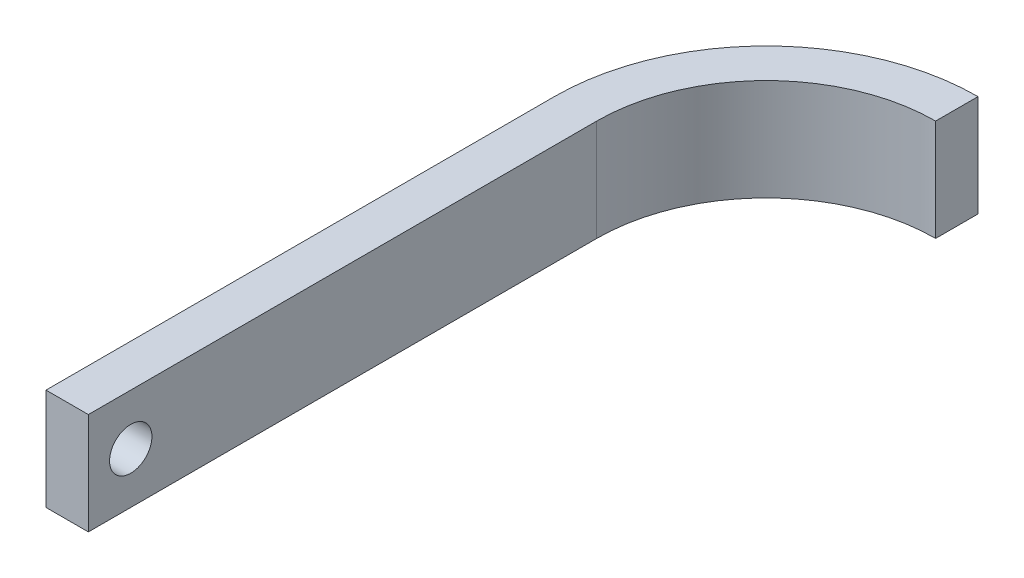
ISO-10303-21;
HEADER;
FILE_DESCRIPTION(('STEP AP214'),'2;1');
FILE_NAME('part.step','',(''),(''),'','','');
FILE_SCHEMA(('AUTOMOTIVE_DESIGN { 1 0 10303 214 1 1 1 1 }'));
ENDSEC;
DATA;
#1=APPLICATION_CONTEXT('core data for automotive mechanical design processes');
#2=APPLICATION_PROTOCOL_DEFINITION('international standard','automotive_design',2000,#1);
#3=PRODUCT_CONTEXT('',#1,'mechanical');
#4=PRODUCT('Part','Part','',(#3));
#5=PRODUCT_RELATED_PRODUCT_CATEGORY('part','',(#4));
#6=PRODUCT_DEFINITION_FORMATION('','',#4);
#7=PRODUCT_DEFINITION_CONTEXT('part definition',#1,'design');
#8=PRODUCT_DEFINITION('design','',#6,#7);
#9=PRODUCT_DEFINITION_SHAPE('','',#8);
#10=(LENGTH_UNIT() NAMED_UNIT(*) SI_UNIT(.MILLI.,.METRE.));
#11=(NAMED_UNIT(*) PLANE_ANGLE_UNIT() SI_UNIT($,.RADIAN.));
#12=(NAMED_UNIT(*) SI_UNIT($,.STERADIAN.) SOLID_ANGLE_UNIT());
#13=UNCERTAINTY_MEASURE_WITH_UNIT(LENGTH_MEASURE(1.E-05),#10,'distance_accuracy_value','');
#14=(GEOMETRIC_REPRESENTATION_CONTEXT(3) GLOBAL_UNCERTAINTY_ASSIGNED_CONTEXT((#13)) GLOBAL_UNIT_ASSIGNED_CONTEXT((#10,
#11,#12)) REPRESENTATION_CONTEXT('',''));
#15=CARTESIAN_POINT('',(0.,0.,0.));
#16=DIRECTION('',(0.,0.,1.));
#17=DIRECTION('',(1.,0.,0.));
#18=AXIS2_PLACEMENT_3D('',#15,#16,#17);
#19=CARTESIAN_POINT('',(0.,15.24,0.));
#20=DIRECTION('',(1.,0.,0.));
#21=DIRECTION('',(0.,0.,-1.));
#22=AXIS2_PLACEMENT_3D('',#19,#20,#21);
#23=PLANE('',#22);
#24=CARTESIAN_POINT('',(0.,7.62,-6.35));
#25=DIRECTION('',(1.,0.,0.));
#26=DIRECTION('',(0.,0.,-1.));
#27=AXIS2_PLACEMENT_3D('',#24,#25,#26);
#28=CIRCLE('',#27,3.175);
#29=CARTESIAN_POINT('',(0.,7.62,-9.525));
#30=VERTEX_POINT('',#29);
#31=EDGE_CURVE('E129',#30,#30,#28,.T.);
#32=ORIENTED_EDGE('',*,*,#31,.T.);
#33=EDGE_LOOP('',(#32));
#34=FACE_BOUND('',#33,.T.);
#35=DIRECTION('',(0.,0.,1.));
#36=VECTOR('',#35,1.);
#37=CARTESIAN_POINT('',(0.,0.,0.));
#38=LINE('',#37,#36);
#39=CARTESIAN_POINT('',(0.,0.,-76.2));
#40=VERTEX_POINT('',#39);
#41=CARTESIAN_POINT('',(0.,0.,0.));
#42=VERTEX_POINT('',#41);
#43=EDGE_CURVE('E125',#40,#42,#38,.T.);
#44=ORIENTED_EDGE('',*,*,#43,.T.);
#45=DIRECTION('',(0.,-1.,0.));
#46=VECTOR('',#45,1.);
#47=CARTESIAN_POINT('',(0.,15.24,0.));
#48=LINE('',#47,#46);
#49=CARTESIAN_POINT('',(0.,15.24,0.));
#50=VERTEX_POINT('',#49);
#51=EDGE_CURVE('E11',#50,#42,#48,.T.);
#52=ORIENTED_EDGE('',*,*,#51,.F.);
#53=DIRECTION('',(0.,0.,1.));
#54=VECTOR('',#53,1.);
#55=CARTESIAN_POINT('',(0.,15.24,0.));
#56=LINE('',#55,#54);
#57=CARTESIAN_POINT('',(0.,15.24,-76.2));
#58=VERTEX_POINT('',#57);
#59=EDGE_CURVE('E136',#58,#50,#56,.T.);
#60=ORIENTED_EDGE('',*,*,#59,.F.);
#61=DIRECTION('',(0.,-1.,0.));
#62=VECTOR('',#61,1.);
#63=CARTESIAN_POINT('',(0.,15.24,-76.2));
#64=LINE('',#63,#62);
#65=EDGE_CURVE('E121',#58,#40,#64,.T.);
#66=ORIENTED_EDGE('',*,*,#65,.T.);
#67=EDGE_LOOP('',(#44,#52,#60,#66));
#68=FACE_BOUND('',#67,.T.);
#69=ADVANCED_FACE('F41',(#34,#68),#23,.F.);
#70=CARTESIAN_POINT('',(0.,15.24,0.));
#71=DIRECTION('',(0.,0.,-1.));
#72=DIRECTION('',(-1.,0.,0.));
#73=AXIS2_PLACEMENT_3D('',#70,#71,#72);
#74=PLANE('',#73);
#75=DIRECTION('',(1.,0.,0.));
#76=VECTOR('',#75,1.);
#77=CARTESIAN_POINT('',(0.,0.,0.));
#78=LINE('',#77,#76);
#79=CARTESIAN_POINT('',(6.35,0.,0.));
#80=VERTEX_POINT('',#79);
#81=EDGE_CURVE('E128',#42,#80,#78,.T.);
#82=ORIENTED_EDGE('',*,*,#81,.T.);
#83=DIRECTION('',(0.,-1.,0.));
#84=VECTOR('',#83,1.);
#85=CARTESIAN_POINT('',(6.35,15.24,0.));
#86=LINE('',#85,#84);
#87=CARTESIAN_POINT('',(6.35,15.24,0.));
#88=VERTEX_POINT('',#87);
#89=EDGE_CURVE('E49',#88,#80,#86,.T.);
#90=ORIENTED_EDGE('',*,*,#89,.F.);
#91=DIRECTION('',(1.,0.,0.));
#92=VECTOR('',#91,1.);
#93=CARTESIAN_POINT('',(0.,15.24,0.));
#94=LINE('',#93,#92);
#95=EDGE_CURVE('E94',#50,#88,#94,.T.);
#96=ORIENTED_EDGE('',*,*,#95,.F.);
#97=ORIENTED_EDGE('',*,*,#51,.T.);
#98=EDGE_LOOP('',(#82,#90,#96,#97));
#99=FACE_BOUND('',#98,.T.);
#100=ADVANCED_FACE('F160',(#99),#74,.F.);
#101=CARTESIAN_POINT('',(6.35,15.24,0.));
#102=DIRECTION('',(-1.,0.,0.));
#103=DIRECTION('',(0.,0.,1.));
#104=AXIS2_PLACEMENT_3D('',#101,#102,#103);
#105=PLANE('',#104);
#106=CARTESIAN_POINT('',(6.35,7.62,-6.35));
#107=DIRECTION('',(1.,0.,0.));
#108=DIRECTION('',(0.,0.,-1.));
#109=AXIS2_PLACEMENT_3D('',#106,#107,#108);
#110=CIRCLE('',#109,3.175);
#111=CARTESIAN_POINT('',(6.35,7.62,-9.525));
#112=VERTEX_POINT('',#111);
#113=EDGE_CURVE('E170',#112,#112,#110,.T.);
#114=ORIENTED_EDGE('',*,*,#113,.F.);
#115=EDGE_LOOP('',(#114));
#116=FACE_BOUND('',#115,.T.);
#117=DIRECTION('',(0.,0.,-1.));
#118=VECTOR('',#117,1.);
#119=CARTESIAN_POINT('',(6.35,0.,0.));
#120=LINE('',#119,#118);
#121=CARTESIAN_POINT('',(6.35,0.,-76.2));
#122=VERTEX_POINT('',#121);
#123=EDGE_CURVE('E131',#80,#122,#120,.T.);
#124=ORIENTED_EDGE('',*,*,#123,.T.);
#125=DIRECTION('',(0.,-1.,0.));
#126=VECTOR('',#125,1.);
#127=CARTESIAN_POINT('',(6.35,15.24,-76.2));
#128=LINE('',#127,#126);
#129=CARTESIAN_POINT('',(6.35,15.24,-76.2));
#130=VERTEX_POINT('',#129);
#131=EDGE_CURVE('E116',#130,#122,#128,.T.);
#132=ORIENTED_EDGE('',*,*,#131,.F.);
#133=DIRECTION('',(0.,0.,-1.));
#134=VECTOR('',#133,1.);
#135=CARTESIAN_POINT('',(6.35,15.24,0.));
#136=LINE('',#135,#134);
#137=EDGE_CURVE('E107',#88,#130,#136,.T.);
#138=ORIENTED_EDGE('',*,*,#137,.F.);
#139=ORIENTED_EDGE('',*,*,#89,.T.);
#140=EDGE_LOOP('',(#124,#132,#138,#139));
#141=FACE_BOUND('',#140,.T.);
#142=ADVANCED_FACE('F142',(#116,#141),#105,.F.);
#143=CARTESIAN_POINT('',(31.75,15.24,-76.2));
#144=DIRECTION('',(0.,-1.,0.));
#145=DIRECTION('',(0.,0.,-1.));
#146=AXIS2_PLACEMENT_3D('',#143,#144,#145);
#147=CYLINDRICAL_SURFACE('',#146,25.4);
#148=CARTESIAN_POINT('',(31.75,0.,-76.2));
#149=DIRECTION('',(0.,-1.,0.));
#150=DIRECTION('',(0.,0.,1.));
#151=AXIS2_PLACEMENT_3D('',#148,#149,#150);
#152=CIRCLE('',#151,25.4);
#153=CARTESIAN_POINT('',(31.75,0.,-101.6));
#154=VERTEX_POINT('',#153);
#155=EDGE_CURVE('E115',#122,#154,#152,.T.);
#156=ORIENTED_EDGE('',*,*,#155,.T.);
#157=DIRECTION('',(0.,-1.,0.));
#158=VECTOR('',#157,1.);
#159=CARTESIAN_POINT('',(31.75,15.24,-101.6));
#160=LINE('',#159,#158);
#161=CARTESIAN_POINT('',(31.75,15.24,-101.6));
#162=VERTEX_POINT('',#161);
#163=EDGE_CURVE('E112',#162,#154,#160,.T.);
#164=ORIENTED_EDGE('',*,*,#163,.F.);
#165=CARTESIAN_POINT('',(31.75,15.24,-76.2));
#166=DIRECTION('',(0.,-1.,0.));
#167=DIRECTION('',(0.,0.,1.));
#168=AXIS2_PLACEMENT_3D('',#165,#166,#167);
#169=CIRCLE('',#168,25.4);
#170=EDGE_CURVE('E101',#130,#162,#169,.T.);
#171=ORIENTED_EDGE('',*,*,#170,.F.);
#172=ORIENTED_EDGE('',*,*,#131,.T.);
#173=EDGE_LOOP('',(#156,#164,#171,#172));
#174=FACE_BOUND('',#173,.T.);
#175=ADVANCED_FACE('F113',(#174),#147,.F.);
#176=CARTESIAN_POINT('',(31.75,15.24,-101.6));
#177=DIRECTION('',(-1.,0.,0.));
#178=DIRECTION('',(0.,0.,1.));
#179=AXIS2_PLACEMENT_3D('',#176,#177,#178);
#180=PLANE('',#179);
#181=DIRECTION('',(0.,0.,-1.));
#182=VECTOR('',#181,1.);
#183=CARTESIAN_POINT('',(31.75,0.,-101.6));
#184=LINE('',#183,#182);
#185=CARTESIAN_POINT('',(31.7499999999999,0.,-107.95));
#186=VERTEX_POINT('',#185);
#187=EDGE_CURVE('E80',#154,#186,#184,.T.);
#188=ORIENTED_EDGE('',*,*,#187,.T.);
#189=DIRECTION('',(0.,-1.,0.));
#190=VECTOR('',#189,1.);
#191=CARTESIAN_POINT('',(31.7499999999999,15.24,-107.95));
#192=LINE('',#191,#190);
#193=CARTESIAN_POINT('',(31.7499999999999,15.24,-107.95));
#194=VERTEX_POINT('',#193);
#195=EDGE_CURVE('E117',#194,#186,#192,.T.);
#196=ORIENTED_EDGE('',*,*,#195,.F.);
#197=DIRECTION('',(0.,0.,-1.));
#198=VECTOR('',#197,1.);
#199=CARTESIAN_POINT('',(31.75,15.24,-101.6));
#200=LINE('',#199,#198);
#201=EDGE_CURVE('E105',#162,#194,#200,.T.);
#202=ORIENTED_EDGE('',*,*,#201,.F.);
#203=ORIENTED_EDGE('',*,*,#163,.T.);
#204=EDGE_LOOP('',(#188,#196,#202,#203));
#205=FACE_BOUND('',#204,.T.);
#206=ADVANCED_FACE('F119',(#205),#180,.F.);
#207=CARTESIAN_POINT('',(31.75,15.24,-76.2));
#208=DIRECTION('',(0.,-1.,0.));
#209=DIRECTION('',(0.,0.,-1.));
#210=AXIS2_PLACEMENT_3D('',#207,#208,#209);
#211=CYLINDRICAL_SURFACE('',#210,31.75);
#212=CARTESIAN_POINT('',(31.75,0.,-76.2));
#213=DIRECTION('',(0.,1.,0.));
#214=DIRECTION('',(0.,0.,1.));
#215=AXIS2_PLACEMENT_3D('',#212,#213,#214);
#216=CIRCLE('',#215,31.75);
#217=EDGE_CURVE('E86',#186,#40,#216,.T.);
#218=ORIENTED_EDGE('',*,*,#217,.T.);
#219=ORIENTED_EDGE('',*,*,#65,.F.);
#220=CARTESIAN_POINT('',(31.75,15.24,-76.2));
#221=DIRECTION('',(0.,1.,0.));
#222=DIRECTION('',(0.,0.,1.));
#223=AXIS2_PLACEMENT_3D('',#220,#221,#222);
#224=CIRCLE('',#223,31.75);
#225=EDGE_CURVE('E57',#194,#58,#224,.T.);
#226=ORIENTED_EDGE('',*,*,#225,.F.);
#227=ORIENTED_EDGE('',*,*,#195,.T.);
#228=EDGE_LOOP('',(#218,#219,#226,#227));
#229=FACE_BOUND('',#228,.T.);
#230=ADVANCED_FACE('F149',(#229),#211,.T.);
#231=CARTESIAN_POINT('',(31.75,15.24,-76.2));
#232=DIRECTION('',(0.,1.,0.));
#233=DIRECTION('',(0.,0.,1.));
#234=AXIS2_PLACEMENT_3D('',#231,#232,#233);
#235=PLANE('',#234);
#236=ORIENTED_EDGE('',*,*,#59,.T.);
#237=ORIENTED_EDGE('',*,*,#95,.T.);
#238=ORIENTED_EDGE('',*,*,#137,.T.);
#239=ORIENTED_EDGE('',*,*,#170,.T.);
#240=ORIENTED_EDGE('',*,*,#201,.T.);
#241=ORIENTED_EDGE('',*,*,#225,.T.);
#242=EDGE_LOOP('',(#236,#237,#238,#239,#240,#241));
#243=FACE_BOUND('',#242,.T.);
#244=ADVANCED_FACE('F103',(#243),#235,.T.);
#245=CARTESIAN_POINT('',(31.75,0.,-76.2));
#246=DIRECTION('',(0.,1.,0.));
#247=DIRECTION('',(0.,0.,1.));
#248=AXIS2_PLACEMENT_3D('',#245,#246,#247);
#249=PLANE('',#248);
#250=ORIENTED_EDGE('',*,*,#43,.F.);
#251=ORIENTED_EDGE('',*,*,#217,.F.);
#252=ORIENTED_EDGE('',*,*,#187,.F.);
#253=ORIENTED_EDGE('',*,*,#155,.F.);
#254=ORIENTED_EDGE('',*,*,#123,.F.);
#255=ORIENTED_EDGE('',*,*,#81,.F.);
#256=EDGE_LOOP('',(#250,#251,#252,#253,#254,#255));
#257=FACE_BOUND('',#256,.T.);
#258=ADVANCED_FACE('F145',(#257),#249,.F.);
#259=CARTESIAN_POINT('',(-8.89,7.62,-6.35));
#260=DIRECTION('',(1.,0.,0.));
#261=DIRECTION('',(0.,0.,-1.));
#262=AXIS2_PLACEMENT_3D('',#259,#260,#261);
#263=CYLINDRICAL_SURFACE('',#262,3.175);
#264=CARTESIAN_POINT('',(6.35,7.62,-9.525));
#265=CARTESIAN_POINT('',(6.28385416666667,7.62,-9.525));
#266=CARTESIAN_POINT('',(6.21770833333333,7.62,-9.525));
#267=CARTESIAN_POINT('',(6.08541666666667,7.62,-9.525));
#268=CARTESIAN_POINT('',(6.01927083333333,7.62,-9.525));
#269=CARTESIAN_POINT('',(5.88697916666667,7.62,-9.525));
#270=CARTESIAN_POINT('',(5.82083333333333,7.62,-9.525));
#271=CARTESIAN_POINT('',(5.68854166666667,7.62,-9.525));
#272=CARTESIAN_POINT('',(5.62239583333333,7.62,-9.525));
#273=CARTESIAN_POINT('',(5.49010416666667,7.62,-9.525));
#274=CARTESIAN_POINT('',(5.42395833333333,7.62,-9.525));
#275=CARTESIAN_POINT('',(5.29166666666667,7.62,-9.525));
#276=CARTESIAN_POINT('',(5.22552083333333,7.62,-9.525));
#277=CARTESIAN_POINT('',(5.09322916666667,7.62,-9.525));
#278=CARTESIAN_POINT('',(5.02708333333333,7.62,-9.525));
#279=CARTESIAN_POINT('',(4.89479166666667,7.62,-9.525));
#280=CARTESIAN_POINT('',(4.82864583333333,7.62,-9.525));
#281=CARTESIAN_POINT('',(4.69635416666667,7.62,-9.525));
#282=CARTESIAN_POINT('',(4.63020833333333,7.62,-9.525));
#283=CARTESIAN_POINT('',(4.49791666666667,7.62,-9.525));
#284=CARTESIAN_POINT('',(4.43177083333333,7.62,-9.525));
#285=CARTESIAN_POINT('',(4.29947916666667,7.62,-9.525));
#286=CARTESIAN_POINT('',(4.23333333333333,7.62,-9.525));
#287=CARTESIAN_POINT('',(4.10104166666667,7.62,-9.525));
#288=CARTESIAN_POINT('',(4.03489583333333,7.62,-9.525));
#289=CARTESIAN_POINT('',(3.90260416666667,7.62,-9.525));
#290=CARTESIAN_POINT('',(3.83645833333333,7.62,-9.525));
#291=CARTESIAN_POINT('',(3.70416666666667,7.62,-9.525));
#292=CARTESIAN_POINT('',(3.63802083333333,7.62,-9.525));
#293=CARTESIAN_POINT('',(3.50572916666667,7.62,-9.525));
#294=CARTESIAN_POINT('',(3.43958333333333,7.62,-9.525));
#295=CARTESIAN_POINT('',(3.30729166666667,7.62,-9.525));
#296=CARTESIAN_POINT('',(3.24114583333333,7.62,-9.525));
#297=CARTESIAN_POINT('',(3.10885416666667,7.62,-9.525));
#298=CARTESIAN_POINT('',(3.04270833333333,7.62,-9.525));
#299=CARTESIAN_POINT('',(2.91041666666667,7.62,-9.525));
#300=CARTESIAN_POINT('',(2.84427083333333,7.62,-9.525));
#301=CARTESIAN_POINT('',(2.71197916666667,7.62,-9.525));
#302=CARTESIAN_POINT('',(2.64583333333333,7.62,-9.525));
#303=CARTESIAN_POINT('',(2.51354166666667,7.62,-9.525));
#304=CARTESIAN_POINT('',(2.44739583333333,7.62,-9.525));
#305=CARTESIAN_POINT('',(2.31510416666667,7.62,-9.525));
#306=CARTESIAN_POINT('',(2.24895833333333,7.62,-9.525));
#307=CARTESIAN_POINT('',(2.11666666666667,7.62,-9.525));
#308=CARTESIAN_POINT('',(2.05052083333333,7.62,-9.525));
#309=CARTESIAN_POINT('',(1.91822916666667,7.62,-9.525));
#310=CARTESIAN_POINT('',(1.85208333333333,7.62,-9.525));
#311=CARTESIAN_POINT('',(1.71979166666667,7.62,-9.525));
#312=CARTESIAN_POINT('',(1.65364583333333,7.62,-9.525));
#313=CARTESIAN_POINT('',(1.52135416666667,7.62,-9.525));
#314=CARTESIAN_POINT('',(1.45520833333333,7.62,-9.525));
#315=CARTESIAN_POINT('',(1.32291666666666,7.62,-9.525));
#316=CARTESIAN_POINT('',(1.25677083333333,7.62,-9.525));
#317=CARTESIAN_POINT('',(1.12447916666667,7.62,-9.525));
#318=CARTESIAN_POINT('',(1.05833333333333,7.62,-9.525));
#319=CARTESIAN_POINT('',(0.926041666666665,7.62,-9.525));
#320=CARTESIAN_POINT('',(0.859895833333331,7.62,-9.525));
#321=CARTESIAN_POINT('',(0.727604166666665,7.62,-9.525));
#322=CARTESIAN_POINT('',(0.661458333333332,7.62,-9.525));
#323=CARTESIAN_POINT('',(0.529166666666665,7.62,-9.525));
#324=CARTESIAN_POINT('',(0.463020833333331,7.62,-9.525));
#325=CARTESIAN_POINT('',(0.330729166666664,7.62,-9.525));
#326=CARTESIAN_POINT('',(0.264583333333331,7.62,-9.525));
#327=CARTESIAN_POINT('',(0.132291666666664,7.62,-9.525));
#328=CARTESIAN_POINT('',(0.0661458333333313,7.62,-9.525));
#329=CARTESIAN_POINT('',(0.,7.62,-9.525));
#330=B_SPLINE_CURVE_WITH_KNOTS('',3,(#264,#265,#266,#267,#268,#269,#270,#271,#272,#273,#274,
#275,#276,#277,#278,#279,#280,#281,#282,#283,#284,#285,#286,#287,#288,#289,#290,#291,#292,#293,
#294,#295,#296,#297,#298,#299,#300,#301,#302,#303,#304,#305,#306,#307,#308,#309,#310,#311,#312,
#313,#314,#315,#316,#317,#318,#319,#320,#321,#322,#323,#324,#325,#326,#327,#328,#329),
.UNSPECIFIED.,.F.,.F.,(4,2,2,2,2,2,2,2,2,2,2,2,2,2,2,2,2,2,2,2,2,2,2,2,2,2,2,2,2,2,2,2,4),(0.,
0.198437500000001,0.396875,0.5953125,0.793749999999999,0.9921875,1.190625,1.3890625,1.5875,
1.7859375,1.984375,2.1828125,2.38125,2.5796875,2.778125,2.9765625,3.175,3.3734375,3.571875,
3.7703125,3.96875,4.1671875,4.365625,4.5640625,4.7625,4.9609375,5.159375,5.3578125,5.55625,
5.7546875,5.953125,6.1515625,6.35),.UNSPECIFIED.);
#331=EDGE_CURVE('BSEAM178',#112,#30,#330,.T.);
#332=ORIENTED_EDGE('',*,*,#113,.T.);
#333=ORIENTED_EDGE('',*,*,#31,.F.);
#334=ORIENTED_EDGE('',*,*,#331,.T.);
#335=ORIENTED_EDGE('',*,*,#331,.F.);
#336=EDGE_LOOP('',(#332,#334,#333,#335));
#337=FACE_BOUND('',#336,.T.);
#338=ADVANCED_FACE('F178',(#337),#263,.F.);
#339=CLOSED_SHELL('',(#69,#100,#142,#175,#206,#230,#244,#258,#338));
#340=MANIFOLD_SOLID_BREP('B2',#339);
#341=ADVANCED_BREP_SHAPE_REPRESENTATION('',(#18,#340),#14);
#342=SHAPE_DEFINITION_REPRESENTATION(#9,#341);
ENDSEC;
END-ISO-10303-21;
